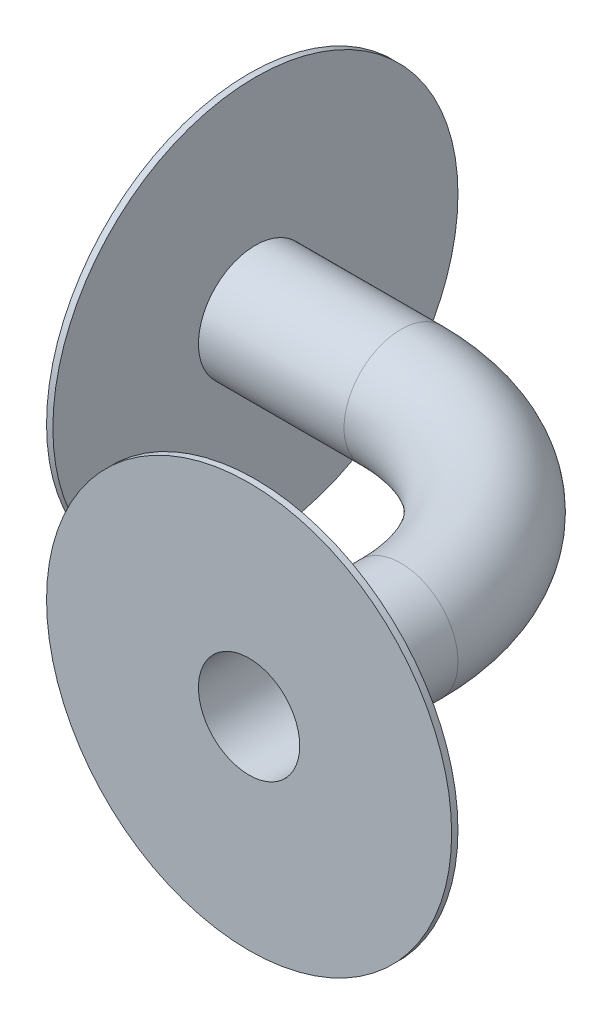
ISO-10303-21;
HEADER;
FILE_DESCRIPTION(('STEP AP214'),'2;1');
FILE_NAME('part.step','',(''),(''),'','','');
FILE_SCHEMA(('AUTOMOTIVE_DESIGN { 1 0 10303 214 1 1 1 1 }'));
ENDSEC;
DATA;
#1=APPLICATION_CONTEXT('core data for automotive mechanical design processes');
#2=APPLICATION_PROTOCOL_DEFINITION('international standard','automotive_design',2000,#1);
#3=PRODUCT_CONTEXT('',#1,'mechanical');
#4=PRODUCT('Part','Part','',(#3));
#5=PRODUCT_RELATED_PRODUCT_CATEGORY('part','',(#4));
#6=PRODUCT_DEFINITION_FORMATION('','',#4);
#7=PRODUCT_DEFINITION_CONTEXT('part definition',#1,'design');
#8=PRODUCT_DEFINITION('design','',#6,#7);
#9=PRODUCT_DEFINITION_SHAPE('','',#8);
#10=(LENGTH_UNIT() NAMED_UNIT(*) SI_UNIT(.MILLI.,.METRE.));
#11=(NAMED_UNIT(*) PLANE_ANGLE_UNIT() SI_UNIT($,.RADIAN.));
#12=(NAMED_UNIT(*) SI_UNIT($,.STERADIAN.) SOLID_ANGLE_UNIT());
#13=UNCERTAINTY_MEASURE_WITH_UNIT(LENGTH_MEASURE(1.E-05),#10,'distance_accuracy_value','');
#14=(GEOMETRIC_REPRESENTATION_CONTEXT(3) GLOBAL_UNCERTAINTY_ASSIGNED_CONTEXT((#13)) GLOBAL_UNIT_ASSIGNED_CONTEXT((#10,
#11,#12)) REPRESENTATION_CONTEXT('',''));
#15=CARTESIAN_POINT('',(0.,0.,0.));
#16=DIRECTION('',(0.,0.,1.));
#17=DIRECTION('',(1.,0.,0.));
#18=AXIS2_PLACEMENT_3D('',#15,#16,#17);
#19=CARTESIAN_POINT('',(50.8,0.,88.9));
#20=DIRECTION('',(0.,0.,-1.));
#21=DIRECTION('',(-1.,0.,0.));
#22=AXIS2_PLACEMENT_3D('',#19,#20,#21);
#23=CYLINDRICAL_SURFACE('',#22,14.2875);
#24=CARTESIAN_POINT('',(50.8,0.,50.8000000000002));
#25=DIRECTION('',(0.,0.,1.));
#26=DIRECTION('',(1.,0.,0.));
#27=AXIS2_PLACEMENT_3D('',#24,#25,#26);
#28=CIRCLE('',#27,14.2875);
#29=CARTESIAN_POINT('',(65.0875,0.,50.8000000000002));
#30=VERTEX_POINT('',#29);
#31=EDGE_CURVE('E33',#30,#30,#28,.T.);
#32=ORIENTED_EDGE('',*,*,#31,.T.);
#33=EDGE_LOOP('',(#32));
#34=FACE_BOUND('',#33,.T.);
#35=CARTESIAN_POINT('',(50.8,0.,87.3125));
#36=DIRECTION('',(0.,0.,1.));
#37=DIRECTION('',(1.,0.,0.));
#38=AXIS2_PLACEMENT_3D('',#35,#36,#37);
#39=CIRCLE('',#38,14.2875);
#40=CARTESIAN_POINT('',(65.0875,0.,87.3125));
#41=VERTEX_POINT('',#40);
#42=EDGE_CURVE('E10',#41,#41,#39,.T.);
#43=ORIENTED_EDGE('',*,*,#42,.F.);
#44=EDGE_LOOP('',(#43));
#45=FACE_BOUND('',#44,.T.);
#46=ADVANCED_FACE('F29',(#34,#45),#23,.T.);
#47=CARTESIAN_POINT('',(-38.1,0.,0.));
#48=DIRECTION('',(1.,0.,0.));
#49=DIRECTION('',(0.,0.,-1.));
#50=AXIS2_PLACEMENT_3D('',#47,#48,#49);
#51=CYLINDRICAL_SURFACE('',#50,14.2875);
#52=CARTESIAN_POINT('',(0.,0.,0.));
#53=DIRECTION('',(-1.,0.,0.));
#54=DIRECTION('',(0.,0.,1.));
#55=AXIS2_PLACEMENT_3D('',#52,#53,#54);
#56=CIRCLE('',#55,14.2875);
#57=CARTESIAN_POINT('',(0.,0.,-14.2875));
#58=VERTEX_POINT('',#57);
#59=EDGE_CURVE('E57',#58,#58,#56,.T.);
#60=CARTESIAN_POINT('',(-36.5125,0.,0.));
#61=DIRECTION('',(-1.,0.,0.));
#62=DIRECTION('',(0.,0.,1.));
#63=AXIS2_PLACEMENT_3D('',#60,#61,#62);
#64=CIRCLE('',#63,14.2875);
#65=CARTESIAN_POINT('',(-36.5125,0.,-14.2875));
#66=VERTEX_POINT('',#65);
#67=EDGE_CURVE('E37',#66,#66,#64,.T.);
#68=CARTESIAN_POINT('',(0.,0.,-14.2875));
#69=CARTESIAN_POINT('',(-0.380338541666666,0.,-14.2875));
#70=CARTESIAN_POINT('',(-0.760677083333332,0.,-14.2875));
#71=CARTESIAN_POINT('',(-1.52135416666666,0.,-14.2875));
#72=CARTESIAN_POINT('',(-1.90169270833333,0.,-14.2875));
#73=CARTESIAN_POINT('',(-2.66236979166667,0.,-14.2875));
#74=CARTESIAN_POINT('',(-3.04270833333333,0.,-14.2875));
#75=CARTESIAN_POINT('',(-3.80338541666667,0.,-14.2875));
#76=CARTESIAN_POINT('',(-4.18372395833333,0.,-14.2875));
#77=CARTESIAN_POINT('',(-4.94440104166667,0.,-14.2875));
#78=CARTESIAN_POINT('',(-5.32473958333333,0.,-14.2875));
#79=CARTESIAN_POINT('',(-6.08541666666667,0.,-14.2875));
#80=CARTESIAN_POINT('',(-6.46575520833334,0.,-14.2875));
#81=CARTESIAN_POINT('',(-7.22643229166667,0.,-14.2875));
#82=CARTESIAN_POINT('',(-7.60677083333333,0.,-14.2875));
#83=CARTESIAN_POINT('',(-8.36744791666666,0.,-14.2875));
#84=CARTESIAN_POINT('',(-8.74778645833333,0.,-14.2875));
#85=CARTESIAN_POINT('',(-9.50846354166666,0.,-14.2875));
#86=CARTESIAN_POINT('',(-9.88880208333333,0.,-14.2875));
#87=CARTESIAN_POINT('',(-10.6494791666667,0.,-14.2875));
#88=CARTESIAN_POINT('',(-11.0298177083333,0.,-14.2875));
#89=CARTESIAN_POINT('',(-11.7904947916667,0.,-14.2875));
#90=CARTESIAN_POINT('',(-12.1708333333333,0.,-14.2875));
#91=CARTESIAN_POINT('',(-12.9315104166667,0.,-14.2875));
#92=CARTESIAN_POINT('',(-13.3118489583333,0.,-14.2875));
#93=CARTESIAN_POINT('',(-14.0725260416667,0.,-14.2875));
#94=CARTESIAN_POINT('',(-14.4528645833333,0.,-14.2875));
#95=CARTESIAN_POINT('',(-15.2135416666667,0.,-14.2875));
#96=CARTESIAN_POINT('',(-15.5938802083333,0.,-14.2875));
#97=CARTESIAN_POINT('',(-16.3545572916667,0.,-14.2875));
#98=CARTESIAN_POINT('',(-16.7348958333333,0.,-14.2875));
#99=CARTESIAN_POINT('',(-17.4955729166667,0.,-14.2875));
#100=CARTESIAN_POINT('',(-17.8759114583333,0.,-14.2875));
#101=CARTESIAN_POINT('',(-18.6365885416667,0.,-14.2875));
#102=CARTESIAN_POINT('',(-19.0169270833333,0.,-14.2875));
#103=CARTESIAN_POINT('',(-19.7776041666667,0.,-14.2875));
#104=CARTESIAN_POINT('',(-20.1579427083333,0.,-14.2875));
#105=CARTESIAN_POINT('',(-20.9186197916667,0.,-14.2875));
#106=CARTESIAN_POINT('',(-21.2989583333333,0.,-14.2875));
#107=CARTESIAN_POINT('',(-22.0596354166667,0.,-14.2875));
#108=CARTESIAN_POINT('',(-22.4399739583333,0.,-14.2875));
#109=CARTESIAN_POINT('',(-23.2006510416667,0.,-14.2875));
#110=CARTESIAN_POINT('',(-23.5809895833333,0.,-14.2875));
#111=CARTESIAN_POINT('',(-24.3416666666667,0.,-14.2875));
#112=CARTESIAN_POINT('',(-24.7220052083333,0.,-14.2875));
#113=CARTESIAN_POINT('',(-25.4826822916667,0.,-14.2875));
#114=CARTESIAN_POINT('',(-25.8630208333333,0.,-14.2875));
#115=CARTESIAN_POINT('',(-26.6236979166667,0.,-14.2875));
#116=CARTESIAN_POINT('',(-27.0040364583333,0.,-14.2875));
#117=CARTESIAN_POINT('',(-27.7647135416667,0.,-14.2875));
#118=CARTESIAN_POINT('',(-28.1450520833333,0.,-14.2875));
#119=CARTESIAN_POINT('',(-28.9057291666667,0.,-14.2875));
#120=CARTESIAN_POINT('',(-29.2860677083333,0.,-14.2875));
#121=CARTESIAN_POINT('',(-30.0467447916667,0.,-14.2875));
#122=CARTESIAN_POINT('',(-30.4270833333333,0.,-14.2875));
#123=CARTESIAN_POINT('',(-31.1877604166667,0.,-14.2875));
#124=CARTESIAN_POINT('',(-31.5680989583333,0.,-14.2875));
#125=CARTESIAN_POINT('',(-32.3287760416667,0.,-14.2875));
#126=CARTESIAN_POINT('',(-32.7091145833333,0.,-14.2875));
#127=CARTESIAN_POINT('',(-33.4697916666667,0.,-14.2875));
#128=CARTESIAN_POINT('',(-33.8501302083333,0.,-14.2875));
#129=CARTESIAN_POINT('',(-34.6108072916667,0.,-14.2875));
#130=CARTESIAN_POINT('',(-34.9911458333333,0.,-14.2875));
#131=CARTESIAN_POINT('',(-35.7518229166667,0.,-14.2875));
#132=CARTESIAN_POINT('',(-36.1321614583333,0.,-14.2875));
#133=CARTESIAN_POINT('',(-36.5125,0.,-14.2875));
#134=B_SPLINE_CURVE_WITH_KNOTS('',3,(#68,#69,#70,#71,#72,#73,#74,#75,#76,#77,#78,#79,#80,#81,
#82,#83,#84,#85,#86,#87,#88,#89,#90,#91,#92,#93,#94,#95,#96,#97,#98,#99,#100,#101,#102,#103,
#104,#105,#106,#107,#108,#109,#110,#111,#112,#113,#114,#115,#116,#117,#118,#119,#120,#121,#122,
#123,#124,#125,#126,#127,#128,#129,#130,#131,#132,#133),.UNSPECIFIED.,.F.,.F.,(4,2,2,2,2,2,2,2,
2,2,2,2,2,2,2,2,2,2,2,2,2,2,2,2,2,2,2,2,2,2,2,2,4),(0.,1.141015625,2.28203125,3.423046875,
4.5640625,5.705078125,6.84609375,7.987109375,9.128125,10.269140625,11.41015625,12.551171875,
13.6921875,14.833203125,15.97421875,17.115234375,18.25625,19.397265625,20.53828125,21.679296875,
22.8203125,23.961328125,25.10234375,26.243359375,27.384375,28.525390625,29.66640625,
30.807421875,31.9484375,33.089453125,34.23046875,35.371484375,36.5125),.UNSPECIFIED.);
#135=EDGE_CURVE('BSEAM80',#58,#66,#134,.T.);
#136=ORIENTED_EDGE('',*,*,#59,.T.);
#137=ORIENTED_EDGE('',*,*,#67,.F.);
#138=ORIENTED_EDGE('',*,*,#135,.T.);
#139=ORIENTED_EDGE('',*,*,#135,.F.);
#140=EDGE_LOOP('',(#136,#138,#137,#139));
#141=FACE_BOUND('',#140,.T.);
#142=ADVANCED_FACE('F80',(#141),#51,.T.);
#143=CARTESIAN_POINT('',(0.,0.,50.8));
#144=DIRECTION('',(0.,1.,0.));
#145=DIRECTION('',(0.,0.,1.));
#146=AXIS2_PLACEMENT_3D('',#143,#144,#145);
#147=TOROIDAL_SURFACE('',#146,50.8,12.7);
#148=CARTESIAN_POINT('',(50.8,0.,50.8));
#149=DIRECTION('',(0.,0.,1.));
#150=DIRECTION('',(1.,0.,0.));
#151=AXIS2_PLACEMENT_3D('',#148,#149,#150);
#152=CIRCLE('',#151,12.7);
#153=CARTESIAN_POINT('',(63.5,0.,50.8));
#154=VERTEX_POINT('',#153);
#155=EDGE_CURVE('E60',#154,#154,#152,.T.);
#156=CARTESIAN_POINT('',(0.,0.,0.));
#157=DIRECTION('',(1.,0.,0.));
#158=DIRECTION('',(0.,0.,-1.));
#159=AXIS2_PLACEMENT_3D('',#156,#157,#158);
#160=CIRCLE('',#159,12.7);
#161=CARTESIAN_POINT('',(0.,0.,-12.7));
#162=VERTEX_POINT('',#161);
#163=EDGE_CURVE('E64',#162,#162,#160,.T.);
#164=CARTESIAN_POINT('',(0.,0.,50.8));
#165=DIRECTION('',(0.,1.,0.));
#166=DIRECTION('',(0.,0.,1.));
#167=AXIS2_PLACEMENT_3D('',#164,#165,#166);
#168=CIRCLE('',#167,63.5);
#169=EDGE_CURVE('',#154,#162,#168,.T.);
#170=ORIENTED_EDGE('',*,*,#155,.T.);
#171=ORIENTED_EDGE('',*,*,#163,.F.);
#172=ORIENTED_EDGE('',*,*,#169,.T.);
#173=ORIENTED_EDGE('',*,*,#169,.F.);
#174=EDGE_LOOP('',(#170,#172,#171,#173));
#175=FACE_BOUND('',#174,.T.);
#176=ADVANCED_FACE('F77',(#175),#147,.F.);
#177=CARTESIAN_POINT('',(0.,0.,50.8));
#178=DIRECTION('',(0.,1.,0.));
#179=DIRECTION('',(0.,0.,1.));
#180=AXIS2_PLACEMENT_3D('',#177,#178,#179);
#181=TOROIDAL_SURFACE('',#180,50.8,14.2875);
#182=CARTESIAN_POINT('',(0.,0.,50.8));
#183=DIRECTION('',(0.,1.,0.));
#184=DIRECTION('',(0.,0.,1.));
#185=AXIS2_PLACEMENT_3D('',#182,#183,#184);
#186=CIRCLE('',#185,65.0875);
#187=EDGE_CURVE('',#30,#58,#186,.T.);
#188=ORIENTED_EDGE('',*,*,#31,.F.);
#189=ORIENTED_EDGE('',*,*,#59,.F.);
#190=ORIENTED_EDGE('',*,*,#187,.T.);
#191=ORIENTED_EDGE('',*,*,#187,.F.);
#192=EDGE_LOOP('',(#188,#190,#189,#191));
#193=FACE_BOUND('',#192,.T.);
#194=ADVANCED_FACE('F31',(#193),#181,.T.);
#195=CARTESIAN_POINT('',(50.8,0.,88.9));
#196=DIRECTION('',(0.,0.,1.));
#197=DIRECTION('',(1.,0.,0.));
#198=AXIS2_PLACEMENT_3D('',#195,#196,#197);
#199=PLANE('',#198);
#200=CARTESIAN_POINT('',(50.8,0.,88.9));
#201=DIRECTION('',(0.,0.,1.));
#202=DIRECTION('',(1.,0.,0.));
#203=AXIS2_PLACEMENT_3D('',#200,#201,#202);
#204=CIRCLE('',#203,12.7);
#205=CARTESIAN_POINT('',(63.5,0.,88.9));
#206=VERTEX_POINT('',#205);
#207=EDGE_CURVE('E61',#206,#206,#204,.T.);
#208=ORIENTED_EDGE('',*,*,#207,.F.);
#209=EDGE_LOOP('',(#208));
#210=FACE_BOUND('',#209,.T.);
#211=CARTESIAN_POINT('',(50.8,0.,88.9));
#212=DIRECTION('',(0.,0.,1.));
#213=DIRECTION('',(1.,0.,0.));
#214=AXIS2_PLACEMENT_3D('',#211,#212,#213);
#215=CIRCLE('',#214,50.8);
#216=CARTESIAN_POINT('',(101.6,0.,88.9));
#217=VERTEX_POINT('',#216);
#218=EDGE_CURVE('E45',#217,#217,#215,.T.);
#219=ORIENTED_EDGE('',*,*,#218,.T.);
#220=EDGE_LOOP('',(#219));
#221=FACE_BOUND('',#220,.T.);
#222=ADVANCED_FACE('F76',(#210,#221),#199,.T.);
#223=CARTESIAN_POINT('',(50.8,0.,88.9));
#224=DIRECTION('',(0.,0.,-1.));
#225=DIRECTION('',(-1.,0.,0.));
#226=AXIS2_PLACEMENT_3D('',#223,#224,#225);
#227=CYLINDRICAL_SURFACE('',#226,12.7);
#228=ORIENTED_EDGE('',*,*,#207,.T.);
#229=EDGE_LOOP('',(#228));
#230=FACE_BOUND('',#229,.T.);
#231=ORIENTED_EDGE('',*,*,#155,.F.);
#232=EDGE_LOOP('',(#231));
#233=FACE_BOUND('',#232,.T.);
#234=ADVANCED_FACE('F117',(#230,#233),#227,.F.);
#235=CARTESIAN_POINT('',(-38.1,0.,0.));
#236=DIRECTION('',(-1.,0.,0.));
#237=DIRECTION('',(0.,0.,1.));
#238=AXIS2_PLACEMENT_3D('',#235,#236,#237);
#239=PLANE('',#238);
#240=CARTESIAN_POINT('',(-38.1,0.,0.));
#241=DIRECTION('',(-1.,0.,0.));
#242=DIRECTION('',(0.,0.,1.));
#243=AXIS2_PLACEMENT_3D('',#240,#241,#242);
#244=CIRCLE('',#243,12.7);
#245=CARTESIAN_POINT('',(-38.1,0.,-12.7));
#246=VERTEX_POINT('',#245);
#247=EDGE_CURVE('E50',#246,#246,#244,.T.);
#248=ORIENTED_EDGE('',*,*,#247,.F.);
#249=EDGE_LOOP('',(#248));
#250=FACE_BOUND('',#249,.T.);
#251=CARTESIAN_POINT('',(-38.1,0.,0.));
#252=DIRECTION('',(-1.,0.,0.));
#253=DIRECTION('',(0.,0.,1.));
#254=AXIS2_PLACEMENT_3D('',#251,#252,#253);
#255=CIRCLE('',#254,50.8);
#256=CARTESIAN_POINT('',(-38.1,0.,50.8));
#257=VERTEX_POINT('',#256);
#258=EDGE_CURVE('E51',#257,#257,#255,.T.);
#259=ORIENTED_EDGE('',*,*,#258,.T.);
#260=EDGE_LOOP('',(#259));
#261=FACE_BOUND('',#260,.T.);
#262=ADVANCED_FACE('F99',(#250,#261),#239,.T.);
#263=CARTESIAN_POINT('',(-38.1,0.,0.));
#264=DIRECTION('',(1.,0.,0.));
#265=DIRECTION('',(0.,0.,-1.));
#266=AXIS2_PLACEMENT_3D('',#263,#264,#265);
#267=CYLINDRICAL_SURFACE('',#266,12.7);
#268=CARTESIAN_POINT('',(-38.1,0.,-12.7));
#269=CARTESIAN_POINT('',(-37.703125,0.,-12.7));
#270=CARTESIAN_POINT('',(-37.30625,0.,-12.7));
#271=CARTESIAN_POINT('',(-36.5125,0.,-12.7));
#272=CARTESIAN_POINT('',(-36.115625,0.,-12.7));
#273=CARTESIAN_POINT('',(-35.321875,0.,-12.7));
#274=CARTESIAN_POINT('',(-34.925,0.,-12.7));
#275=CARTESIAN_POINT('',(-34.13125,0.,-12.7));
#276=CARTESIAN_POINT('',(-33.734375,0.,-12.7));
#277=CARTESIAN_POINT('',(-32.940625,0.,-12.7));
#278=CARTESIAN_POINT('',(-32.54375,0.,-12.7));
#279=CARTESIAN_POINT('',(-31.75,0.,-12.7));
#280=CARTESIAN_POINT('',(-31.353125,0.,-12.7));
#281=CARTESIAN_POINT('',(-30.559375,0.,-12.7));
#282=CARTESIAN_POINT('',(-30.1625,0.,-12.7));
#283=CARTESIAN_POINT('',(-29.36875,0.,-12.7));
#284=CARTESIAN_POINT('',(-28.971875,0.,-12.7));
#285=CARTESIAN_POINT('',(-28.178125,0.,-12.7));
#286=CARTESIAN_POINT('',(-27.78125,0.,-12.7));
#287=CARTESIAN_POINT('',(-26.9875,0.,-12.7));
#288=CARTESIAN_POINT('',(-26.590625,0.,-12.7));
#289=CARTESIAN_POINT('',(-25.796875,0.,-12.7));
#290=CARTESIAN_POINT('',(-25.4,0.,-12.7));
#291=CARTESIAN_POINT('',(-24.60625,0.,-12.7));
#292=CARTESIAN_POINT('',(-24.209375,0.,-12.7));
#293=CARTESIAN_POINT('',(-23.415625,0.,-12.7));
#294=CARTESIAN_POINT('',(-23.01875,0.,-12.7));
#295=CARTESIAN_POINT('',(-22.225,0.,-12.7));
#296=CARTESIAN_POINT('',(-21.828125,0.,-12.7));
#297=CARTESIAN_POINT('',(-21.034375,0.,-12.7));
#298=CARTESIAN_POINT('',(-20.6375,0.,-12.7));
#299=CARTESIAN_POINT('',(-19.84375,0.,-12.7));
#300=CARTESIAN_POINT('',(-19.446875,0.,-12.7));
#301=CARTESIAN_POINT('',(-18.653125,0.,-12.7));
#302=CARTESIAN_POINT('',(-18.25625,0.,-12.7));
#303=CARTESIAN_POINT('',(-17.4625,0.,-12.7));
#304=CARTESIAN_POINT('',(-17.065625,0.,-12.7));
#305=CARTESIAN_POINT('',(-16.271875,0.,-12.7));
#306=CARTESIAN_POINT('',(-15.875,0.,-12.7));
#307=CARTESIAN_POINT('',(-15.08125,0.,-12.7));
#308=CARTESIAN_POINT('',(-14.684375,0.,-12.7));
#309=CARTESIAN_POINT('',(-13.890625,0.,-12.7));
#310=CARTESIAN_POINT('',(-13.49375,0.,-12.7));
#311=CARTESIAN_POINT('',(-12.7,0.,-12.7));
#312=CARTESIAN_POINT('',(-12.303125,0.,-12.7));
#313=CARTESIAN_POINT('',(-11.509375,0.,-12.7));
#314=CARTESIAN_POINT('',(-11.1125,0.,-12.7));
#315=CARTESIAN_POINT('',(-10.31875,0.,-12.7));
#316=CARTESIAN_POINT('',(-9.92187499999999,0.,-12.7));
#317=CARTESIAN_POINT('',(-9.128125,0.,-12.7));
#318=CARTESIAN_POINT('',(-8.73124999999999,0.,-12.7));
#319=CARTESIAN_POINT('',(-7.93749999999999,0.,-12.7));
#320=CARTESIAN_POINT('',(-7.54062499999999,0.,-12.7));
#321=CARTESIAN_POINT('',(-6.746875,0.,-12.7));
#322=CARTESIAN_POINT('',(-6.35,0.,-12.7));
#323=CARTESIAN_POINT('',(-5.55625,0.,-12.7));
#324=CARTESIAN_POINT('',(-5.159375,0.,-12.7));
#325=CARTESIAN_POINT('',(-4.365625,0.,-12.7));
#326=CARTESIAN_POINT('',(-3.96875,0.,-12.7));
#327=CARTESIAN_POINT('',(-3.175,0.,-12.7));
#328=CARTESIAN_POINT('',(-2.778125,0.,-12.7));
#329=CARTESIAN_POINT('',(-1.984375,0.,-12.7));
#330=CARTESIAN_POINT('',(-1.5875,0.,-12.7));
#331=CARTESIAN_POINT('',(-0.79375,0.,-12.7));
#332=CARTESIAN_POINT('',(-0.396875,0.,-12.7));
#333=CARTESIAN_POINT('',(0.,0.,-12.7));
#334=B_SPLINE_CURVE_WITH_KNOTS('',3,(#268,#269,#270,#271,#272,#273,#274,#275,#276,#277,#278,
#279,#280,#281,#282,#283,#284,#285,#286,#287,#288,#289,#290,#291,#292,#293,#294,#295,#296,#297,
#298,#299,#300,#301,#302,#303,#304,#305,#306,#307,#308,#309,#310,#311,#312,#313,#314,#315,#316,
#317,#318,#319,#320,#321,#322,#323,#324,#325,#326,#327,#328,#329,#330,#331,#332,#333),
.UNSPECIFIED.,.F.,.F.,(4,2,2,2,2,2,2,2,2,2,2,2,2,2,2,2,2,2,2,2,2,2,2,2,2,2,2,2,2,2,2,2,4),(0.,
1.190625,2.38125,3.571875,4.7625,5.953125,7.14375,8.334375,9.52500000000001,10.715625,11.90625,
13.096875,14.2875,15.478125,16.66875,17.859375,19.05,20.240625,21.43125,22.621875,23.8125,
25.003125,26.19375,27.384375,28.575,29.765625,30.95625,32.146875,33.3375,34.528125,35.71875,
36.909375,38.1),.UNSPECIFIED.);
#335=EDGE_CURVE('BSEAM89',#246,#162,#334,.T.);
#336=ORIENTED_EDGE('',*,*,#247,.T.);
#337=ORIENTED_EDGE('',*,*,#163,.T.);
#338=ORIENTED_EDGE('',*,*,#335,.T.);
#339=ORIENTED_EDGE('',*,*,#335,.F.);
#340=EDGE_LOOP('',(#336,#338,#337,#339));
#341=FACE_BOUND('',#340,.T.);
#342=ADVANCED_FACE('F89',(#341),#267,.F.);
#343=CARTESIAN_POINT('',(-36.5125,0.,0.));
#344=DIRECTION('',(-1.,0.,0.));
#345=DIRECTION('',(0.,0.,1.));
#346=AXIS2_PLACEMENT_3D('',#343,#344,#345);
#347=PLANE('',#346);
#348=CARTESIAN_POINT('',(-36.5125,0.,0.));
#349=DIRECTION('',(-1.,0.,0.));
#350=DIRECTION('',(0.,0.,1.));
#351=AXIS2_PLACEMENT_3D('',#348,#349,#350);
#352=CIRCLE('',#351,50.8);
#353=CARTESIAN_POINT('',(-36.5125,0.,50.8));
#354=VERTEX_POINT('',#353);
#355=EDGE_CURVE('E47',#354,#354,#352,.T.);
#356=ORIENTED_EDGE('',*,*,#355,.F.);
#357=EDGE_LOOP('',(#356));
#358=FACE_BOUND('',#357,.T.);
#359=ORIENTED_EDGE('',*,*,#67,.T.);
#360=EDGE_LOOP('',(#359));
#361=FACE_BOUND('',#360,.T.);
#362=ADVANCED_FACE('F86',(#358,#361),#347,.F.);
#363=CARTESIAN_POINT('',(-36.5125,0.,0.));
#364=DIRECTION('',(-1.,0.,0.));
#365=DIRECTION('',(0.,0.,1.));
#366=AXIS2_PLACEMENT_3D('',#363,#364,#365);
#367=CYLINDRICAL_SURFACE('',#366,50.8);
#368=ORIENTED_EDGE('',*,*,#355,.T.);
#369=EDGE_LOOP('',(#368));
#370=FACE_BOUND('',#369,.T.);
#371=ORIENTED_EDGE('',*,*,#258,.F.);
#372=EDGE_LOOP('',(#371));
#373=FACE_BOUND('',#372,.T.);
#374=ADVANCED_FACE('F88',(#370,#373),#367,.T.);
#375=CARTESIAN_POINT('',(50.8,0.,87.3125));
#376=DIRECTION('',(0.,0.,1.));
#377=DIRECTION('',(1.,0.,0.));
#378=AXIS2_PLACEMENT_3D('',#375,#376,#377);
#379=PLANE('',#378);
#380=CARTESIAN_POINT('',(50.8,0.,87.3125));
#381=DIRECTION('',(0.,0.,1.));
#382=DIRECTION('',(1.,0.,0.));
#383=AXIS2_PLACEMENT_3D('',#380,#381,#382);
#384=CIRCLE('',#383,50.8);
#385=CARTESIAN_POINT('',(101.6,0.,87.3125));
#386=VERTEX_POINT('',#385);
#387=EDGE_CURVE('E53',#386,#386,#384,.T.);
#388=ORIENTED_EDGE('',*,*,#387,.F.);
#389=EDGE_LOOP('',(#388));
#390=FACE_BOUND('',#389,.T.);
#391=ORIENTED_EDGE('',*,*,#42,.T.);
#392=EDGE_LOOP('',(#391));
#393=FACE_BOUND('',#392,.T.);
#394=ADVANCED_FACE('F96',(#390,#393),#379,.F.);
#395=CARTESIAN_POINT('',(50.8,0.,87.3125));
#396=DIRECTION('',(0.,0.,1.));
#397=DIRECTION('',(1.,0.,0.));
#398=AXIS2_PLACEMENT_3D('',#395,#396,#397);
#399=CYLINDRICAL_SURFACE('',#398,50.8);
#400=ORIENTED_EDGE('',*,*,#387,.T.);
#401=EDGE_LOOP('',(#400));
#402=FACE_BOUND('',#401,.T.);
#403=ORIENTED_EDGE('',*,*,#218,.F.);
#404=EDGE_LOOP('',(#403));
#405=FACE_BOUND('',#404,.T.);
#406=ADVANCED_FACE('F135',(#402,#405),#399,.T.);
#407=CLOSED_SHELL('',(#46,#142,#176,#194,#222,#234,#262,#342,#362,#374,#394,#406));
#408=MANIFOLD_SOLID_BREP('B2',#407);
#409=ADVANCED_BREP_SHAPE_REPRESENTATION('',(#18,#408),#14);
#410=SHAPE_DEFINITION_REPRESENTATION(#9,#409);
ENDSEC;
END-ISO-10303-21;
